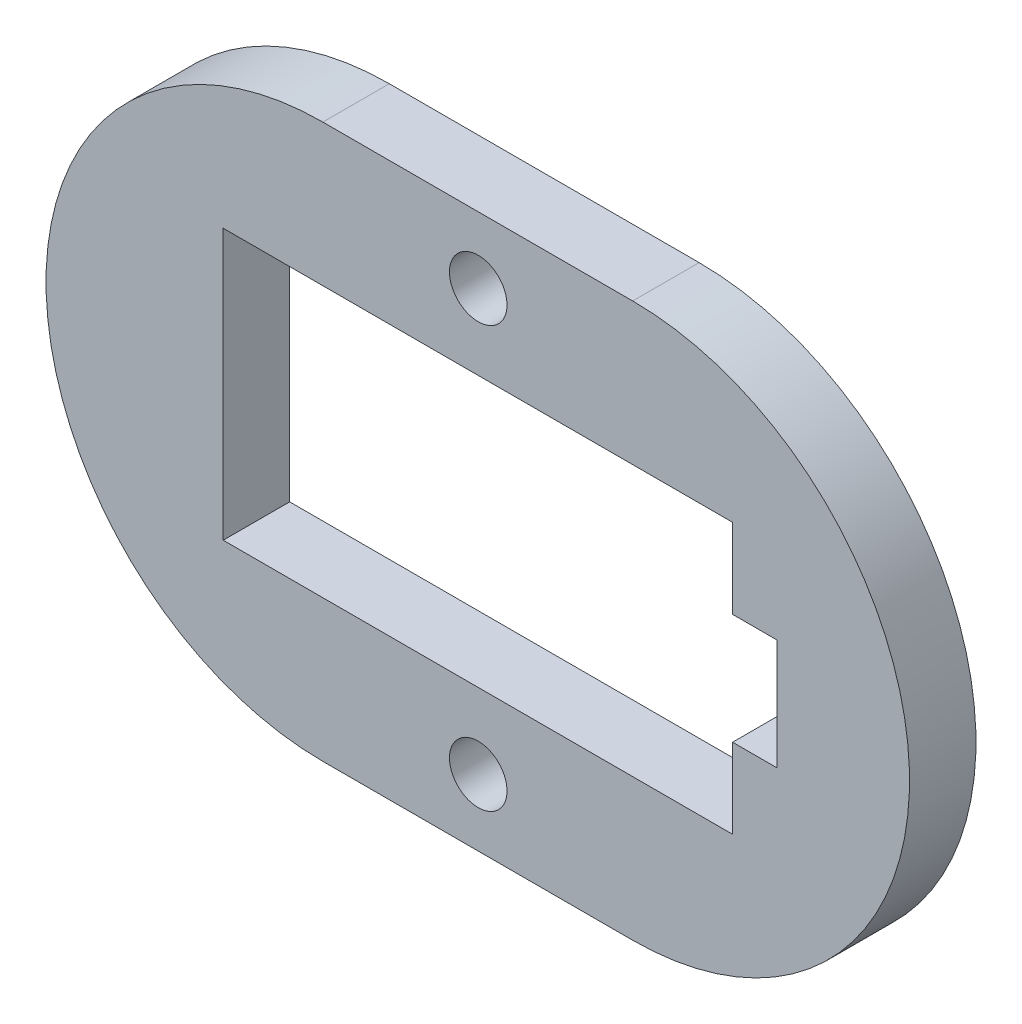
ISO-10303-21;
HEADER;
FILE_DESCRIPTION(('STEP AP214'),'2;1');
FILE_NAME('part.step','',(''),(''),'','','');
FILE_SCHEMA(('AUTOMOTIVE_DESIGN { 1 0 10303 214 1 1 1 1 }'));
ENDSEC;
DATA;
#1=APPLICATION_CONTEXT('core data for automotive mechanical design processes');
#2=APPLICATION_PROTOCOL_DEFINITION('international standard','automotive_design',2000,#1);
#3=PRODUCT_CONTEXT('',#1,'mechanical');
#4=PRODUCT('Part','Part','',(#3));
#5=PRODUCT_RELATED_PRODUCT_CATEGORY('part','',(#4));
#6=PRODUCT_DEFINITION_FORMATION('','',#4);
#7=PRODUCT_DEFINITION_CONTEXT('part definition',#1,'design');
#8=PRODUCT_DEFINITION('design','',#6,#7);
#9=PRODUCT_DEFINITION_SHAPE('','',#8);
#10=(LENGTH_UNIT() NAMED_UNIT(*) SI_UNIT(.MILLI.,.METRE.));
#11=(NAMED_UNIT(*) PLANE_ANGLE_UNIT() SI_UNIT($,.RADIAN.));
#12=(NAMED_UNIT(*) SI_UNIT($,.STERADIAN.) SOLID_ANGLE_UNIT());
#13=UNCERTAINTY_MEASURE_WITH_UNIT(LENGTH_MEASURE(1.E-05),#10,'distance_accuracy_value','');
#14=(GEOMETRIC_REPRESENTATION_CONTEXT(3) GLOBAL_UNCERTAINTY_ASSIGNED_CONTEXT((#13)) GLOBAL_UNIT_ASSIGNED_CONTEXT((#10,
#11,#12)) REPRESENTATION_CONTEXT('',''));
#15=CARTESIAN_POINT('',(0.,0.,0.));
#16=DIRECTION('',(0.,0.,1.));
#17=DIRECTION('',(1.,0.,0.));
#18=AXIS2_PLACEMENT_3D('',#15,#16,#17);
#19=CARTESIAN_POINT('',(-8.50332215613228,12.5005,0.));
#20=DIRECTION('',(0.,0.,1.));
#21=DIRECTION('',(1.,0.,0.));
#22=AXIS2_PLACEMENT_3D('',#19,#20,#21);
#23=CYLINDRICAL_SURFACE('',#22,12.5);
#24=CARTESIAN_POINT('',(-8.50332215613228,12.5005,3.));
#25=DIRECTION('',(0.,0.,1.));
#26=DIRECTION('',(1.,0.,0.));
#27=AXIS2_PLACEMENT_3D('',#24,#25,#26);
#28=CIRCLE('',#27,12.5);
#29=CARTESIAN_POINT('',(-8.50332215613228,25.0005,3.));
#30=VERTEX_POINT('',#29);
#31=CARTESIAN_POINT('',(-8.50332215613228,0.000500000000009174,3.));
#32=VERTEX_POINT('',#31);
#33=EDGE_CURVE('E203',#30,#32,#28,.T.);
#34=ORIENTED_EDGE('',*,*,#33,.F.);
#35=DIRECTION('',(0.,0.,1.));
#36=VECTOR('',#35,1.);
#37=CARTESIAN_POINT('',(-8.50332215613228,25.0005,0.));
#38=LINE('',#37,#36);
#39=CARTESIAN_POINT('',(-8.50332215613228,25.0005,0.));
#40=VERTEX_POINT('',#39);
#41=EDGE_CURVE('E11',#40,#30,#38,.T.);
#42=ORIENTED_EDGE('',*,*,#41,.F.);
#43=CARTESIAN_POINT('',(-8.50332215613228,12.5005,0.));
#44=DIRECTION('',(0.,0.,1.));
#45=DIRECTION('',(1.,0.,0.));
#46=AXIS2_PLACEMENT_3D('',#43,#44,#45);
#47=CIRCLE('',#46,12.5);
#48=CARTESIAN_POINT('',(-8.50332215613228,0.000500000000009174,0.));
#49=VERTEX_POINT('',#48);
#50=EDGE_CURVE('E206',#40,#49,#47,.T.);
#51=ORIENTED_EDGE('',*,*,#50,.T.);
#52=DIRECTION('',(0.,0.,1.));
#53=VECTOR('',#52,1.);
#54=CARTESIAN_POINT('',(-8.50332215613228,0.000500000000009174,0.));
#55=LINE('',#54,#53);
#56=EDGE_CURVE('E39',#49,#32,#55,.T.);
#57=ORIENTED_EDGE('',*,*,#56,.T.);
#58=EDGE_LOOP('',(#34,#42,#51,#57));
#59=FACE_BOUND('',#58,.T.);
#60=ADVANCED_FACE('F36',(#59),#23,.T.);
#61=CARTESIAN_POINT('',(5.48658852914815,25.0005,0.));
#62=DIRECTION('',(0.,1.,0.));
#63=DIRECTION('',(0.,0.,1.));
#64=AXIS2_PLACEMENT_3D('',#61,#62,#63);
#65=PLANE('',#64);
#66=DIRECTION('',(-1.,0.,0.));
#67=VECTOR('',#66,1.);
#68=CARTESIAN_POINT('',(5.48658852914815,25.0005,3.));
#69=LINE('',#68,#67);
#70=CARTESIAN_POINT('',(5.48658852914815,25.0005,3.));
#71=VERTEX_POINT('',#70);
#72=EDGE_CURVE('E210',#71,#30,#69,.T.);
#73=ORIENTED_EDGE('',*,*,#72,.F.);
#74=DIRECTION('',(0.,0.,1.));
#75=VECTOR('',#74,1.);
#76=CARTESIAN_POINT('',(5.48658852914815,25.0005,0.));
#77=LINE('',#76,#75);
#78=CARTESIAN_POINT('',(5.48658852914815,25.0005,0.));
#79=VERTEX_POINT('',#78);
#80=EDGE_CURVE('E44',#79,#71,#77,.T.);
#81=ORIENTED_EDGE('',*,*,#80,.F.);
#82=DIRECTION('',(-1.,0.,0.));
#83=VECTOR('',#82,1.);
#84=CARTESIAN_POINT('',(5.48658852914815,25.0005,0.));
#85=LINE('',#84,#83);
#86=EDGE_CURVE('E216',#79,#40,#85,.T.);
#87=ORIENTED_EDGE('',*,*,#86,.T.);
#88=ORIENTED_EDGE('',*,*,#41,.T.);
#89=EDGE_LOOP('',(#73,#81,#87,#88));
#90=FACE_BOUND('',#89,.T.);
#91=ADVANCED_FACE('F242',(#90),#65,.T.);
#92=CARTESIAN_POINT('',(5.48658852914815,12.5005,0.));
#93=DIRECTION('',(0.,0.,1.));
#94=DIRECTION('',(1.,0.,0.));
#95=AXIS2_PLACEMENT_3D('',#92,#93,#94);
#96=CYLINDRICAL_SURFACE('',#95,12.5);
#97=CARTESIAN_POINT('',(5.48658852914815,12.5005,3.));
#98=DIRECTION('',(0.,0.,1.));
#99=DIRECTION('',(-1.,0.,0.));
#100=AXIS2_PLACEMENT_3D('',#97,#98,#99);
#101=CIRCLE('',#100,12.5);
#102=CARTESIAN_POINT('',(5.48658852914815,0.000499999999976214,3.));
#103=VERTEX_POINT('',#102);
#104=EDGE_CURVE('E224',#103,#71,#101,.T.);
#105=ORIENTED_EDGE('',*,*,#104,.F.);
#106=DIRECTION('',(0.,0.,1.));
#107=VECTOR('',#106,1.);
#108=CARTESIAN_POINT('',(5.48658852914815,0.000499999999976214,0.));
#109=LINE('',#108,#107);
#110=CARTESIAN_POINT('',(5.48658852914815,0.000499999999976214,0.));
#111=VERTEX_POINT('',#110);
#112=EDGE_CURVE('E229',#111,#103,#109,.T.);
#113=ORIENTED_EDGE('',*,*,#112,.F.);
#114=CARTESIAN_POINT('',(5.48658852914815,12.5005,0.));
#115=DIRECTION('',(0.,0.,1.));
#116=DIRECTION('',(-1.,0.,0.));
#117=AXIS2_PLACEMENT_3D('',#114,#115,#116);
#118=CIRCLE('',#117,12.5);
#119=EDGE_CURVE('E213',#111,#79,#118,.T.);
#120=ORIENTED_EDGE('',*,*,#119,.T.);
#121=ORIENTED_EDGE('',*,*,#80,.T.);
#122=EDGE_LOOP('',(#105,#113,#120,#121));
#123=FACE_BOUND('',#122,.T.);
#124=ADVANCED_FACE('F247',(#123),#96,.T.);
#125=CARTESIAN_POINT('',(-8.50332215613228,0.000500000000009174,0.));
#126=DIRECTION('',(0.,-1.,0.));
#127=DIRECTION('',(1.,0.,0.));
#128=AXIS2_PLACEMENT_3D('',#125,#126,#127);
#129=PLANE('',#128);
#130=DIRECTION('',(1.,0.,0.));
#131=VECTOR('',#130,1.);
#132=CARTESIAN_POINT('',(-8.50332215613228,0.000500000000009174,3.));
#133=LINE('',#132,#131);
#134=EDGE_CURVE('E221',#32,#103,#133,.T.);
#135=ORIENTED_EDGE('',*,*,#134,.F.);
#136=ORIENTED_EDGE('',*,*,#56,.F.);
#137=DIRECTION('',(1.,0.,0.));
#138=VECTOR('',#137,1.);
#139=CARTESIAN_POINT('',(-8.50332215613228,0.000500000000009174,0.));
#140=LINE('',#139,#138);
#141=EDGE_CURVE('E209',#49,#111,#140,.T.);
#142=ORIENTED_EDGE('',*,*,#141,.T.);
#143=ORIENTED_EDGE('',*,*,#112,.T.);
#144=EDGE_LOOP('',(#135,#136,#142,#143));
#145=FACE_BOUND('',#144,.T.);
#146=ADVANCED_FACE('F237',(#145),#129,.T.);
#147=CARTESIAN_POINT('',(-8.50332215613228,12.5005,0.));
#148=DIRECTION('',(0.,0.,1.));
#149=DIRECTION('',(1.,0.,0.));
#150=AXIS2_PLACEMENT_3D('',#147,#148,#149);
#151=PLANE('',#150);
#152=DIRECTION('',(0.,1.,0.));
#153=VECTOR('',#152,1.);
#154=CARTESIAN_POINT('',(11.9977947172437,15.,0.));
#155=LINE('',#154,#153);
#156=CARTESIAN_POINT('',(11.9977947172437,10.001,0.));
#157=VERTEX_POINT('',#156);
#158=CARTESIAN_POINT('',(11.9977947172437,15.,0.));
#159=VERTEX_POINT('',#158);
#160=EDGE_CURVE('E133',#157,#159,#155,.T.);
#161=ORIENTED_EDGE('',*,*,#160,.T.);
#162=DIRECTION('',(-1.,0.,0.));
#163=VECTOR('',#162,1.);
#164=CARTESIAN_POINT('',(9.99689471724373,15.,0.));
#165=LINE('',#164,#163);
#166=CARTESIAN_POINT('',(9.99689471724373,15.,0.));
#167=VERTEX_POINT('',#166);
#168=EDGE_CURVE('E127',#159,#167,#165,.T.);
#169=ORIENTED_EDGE('',*,*,#168,.T.);
#170=DIRECTION('',(0.,1.,0.));
#171=VECTOR('',#170,1.);
#172=CARTESIAN_POINT('',(9.99689471724373,18.6,0.));
#173=LINE('',#172,#171);
#174=CARTESIAN_POINT('',(9.99689471724373,18.6,0.));
#175=VERTEX_POINT('',#174);
#176=EDGE_CURVE('E136',#167,#175,#173,.T.);
#177=ORIENTED_EDGE('',*,*,#176,.T.);
#178=DIRECTION('',(-1.,0.,0.));
#179=VECTOR('',#178,1.);
#180=CARTESIAN_POINT('',(-13.0026052827563,18.6,0.));
#181=LINE('',#180,#179);
#182=CARTESIAN_POINT('',(-13.0026052827563,18.6,0.));
#183=VERTEX_POINT('',#182);
#184=EDGE_CURVE('E52',#175,#183,#181,.T.);
#185=ORIENTED_EDGE('',*,*,#184,.T.);
#186=DIRECTION('',(0.,-1.,0.));
#187=VECTOR('',#186,1.);
#188=CARTESIAN_POINT('',(-13.0026052827563,6.4,0.));
#189=LINE('',#188,#187);
#190=CARTESIAN_POINT('',(-13.0026052827563,6.4,0.));
#191=VERTEX_POINT('',#190);
#192=EDGE_CURVE('E151',#183,#191,#189,.T.);
#193=ORIENTED_EDGE('',*,*,#192,.T.);
#194=DIRECTION('',(1.,0.,0.));
#195=VECTOR('',#194,1.);
#196=CARTESIAN_POINT('',(9.99689471724373,6.4,0.));
#197=LINE('',#196,#195);
#198=CARTESIAN_POINT('',(9.99689471724373,6.4,0.));
#199=VERTEX_POINT('',#198);
#200=EDGE_CURVE('E154',#191,#199,#197,.T.);
#201=ORIENTED_EDGE('',*,*,#200,.T.);
#202=DIRECTION('',(0.,1.,0.));
#203=VECTOR('',#202,1.);
#204=CARTESIAN_POINT('',(9.99689471724373,10.001,0.));
#205=LINE('',#204,#203);
#206=CARTESIAN_POINT('',(9.99689471724373,10.001,0.));
#207=VERTEX_POINT('',#206);
#208=EDGE_CURVE('E157',#199,#207,#205,.T.);
#209=ORIENTED_EDGE('',*,*,#208,.T.);
#210=DIRECTION('',(1.,0.,0.));
#211=VECTOR('',#210,1.);
#212=CARTESIAN_POINT('',(11.9977947172437,10.001,0.));
#213=LINE('',#212,#211);
#214=EDGE_CURVE('E160',#207,#157,#213,.T.);
#215=ORIENTED_EDGE('',*,*,#214,.T.);
#216=EDGE_LOOP('',(#161,#169,#177,#185,#193,#201,#209,#215));
#217=FACE_BOUND('',#216,.T.);
#218=CARTESIAN_POINT('',(-1.48790597129112,22.0005,0.));
#219=DIRECTION('',(0.,0.,1.));
#220=DIRECTION('',(-1.,0.,0.));
#221=AXIS2_PLACEMENT_3D('',#218,#219,#220);
#222=CIRCLE('',#221,1.3);
#223=CARTESIAN_POINT('',(-2.78790597129112,22.0005,0.));
#224=VERTEX_POINT('',#223);
#225=EDGE_CURVE('E194',#224,#224,#222,.T.);
#226=ORIENTED_EDGE('',*,*,#225,.T.);
#227=EDGE_LOOP('',(#226));
#228=FACE_BOUND('',#227,.T.);
#229=CARTESIAN_POINT('',(-1.48790597129112,2.9995,0.));
#230=DIRECTION('',(0.,0.,1.));
#231=DIRECTION('',(-1.,0.,0.));
#232=AXIS2_PLACEMENT_3D('',#229,#230,#231);
#233=CIRCLE('',#232,1.3);
#234=CARTESIAN_POINT('',(-2.78790597129112,2.9995,0.));
#235=VERTEX_POINT('',#234);
#236=EDGE_CURVE('E200',#235,#235,#233,.T.);
#237=ORIENTED_EDGE('',*,*,#236,.T.);
#238=EDGE_LOOP('',(#237));
#239=FACE_BOUND('',#238,.T.);
#240=ORIENTED_EDGE('',*,*,#50,.F.);
#241=ORIENTED_EDGE('',*,*,#86,.F.);
#242=ORIENTED_EDGE('',*,*,#119,.F.);
#243=ORIENTED_EDGE('',*,*,#141,.F.);
#244=EDGE_LOOP('',(#240,#241,#242,#243));
#245=FACE_BOUND('',#244,.T.);
#246=ADVANCED_FACE('F140',(#217,#228,#239,#245),#151,.F.);
#247=CARTESIAN_POINT('',(-8.50332215613228,12.5005,3.));
#248=DIRECTION('',(0.,0.,1.));
#249=DIRECTION('',(1.,0.,0.));
#250=AXIS2_PLACEMENT_3D('',#247,#248,#249);
#251=PLANE('',#250);
#252=DIRECTION('',(-1.,0.,0.));
#253=VECTOR('',#252,1.);
#254=CARTESIAN_POINT('',(9.99689471724373,15.,3.));
#255=LINE('',#254,#253);
#256=CARTESIAN_POINT('',(11.9977947172437,15.,3.));
#257=VERTEX_POINT('',#256);
#258=CARTESIAN_POINT('',(9.99689471724373,15.,3.));
#259=VERTEX_POINT('',#258);
#260=EDGE_CURVE('E60',#257,#259,#255,.T.);
#261=ORIENTED_EDGE('',*,*,#260,.F.);
#262=DIRECTION('',(0.,1.,0.));
#263=VECTOR('',#262,1.);
#264=CARTESIAN_POINT('',(11.9977947172437,15.,3.));
#265=LINE('',#264,#263);
#266=CARTESIAN_POINT('',(11.9977947172437,10.001,3.));
#267=VERTEX_POINT('',#266);
#268=EDGE_CURVE('E144',#267,#257,#265,.T.);
#269=ORIENTED_EDGE('',*,*,#268,.F.);
#270=DIRECTION('',(1.,0.,0.));
#271=VECTOR('',#270,1.);
#272=CARTESIAN_POINT('',(11.9977947172437,10.001,3.));
#273=LINE('',#272,#271);
#274=CARTESIAN_POINT('',(9.99689471724373,10.001,3.));
#275=VERTEX_POINT('',#274);
#276=EDGE_CURVE('E147',#275,#267,#273,.T.);
#277=ORIENTED_EDGE('',*,*,#276,.F.);
#278=DIRECTION('',(0.,1.,0.));
#279=VECTOR('',#278,1.);
#280=CARTESIAN_POINT('',(9.99689471724373,10.001,3.));
#281=LINE('',#280,#279);
#282=CARTESIAN_POINT('',(9.99689471724373,6.4,3.));
#283=VERTEX_POINT('',#282);
#284=EDGE_CURVE('E175',#283,#275,#281,.T.);
#285=ORIENTED_EDGE('',*,*,#284,.F.);
#286=DIRECTION('',(1.,0.,0.));
#287=VECTOR('',#286,1.);
#288=CARTESIAN_POINT('',(9.99689471724373,6.4,3.));
#289=LINE('',#288,#287);
#290=CARTESIAN_POINT('',(-13.0026052827563,6.4,3.));
#291=VERTEX_POINT('',#290);
#292=EDGE_CURVE('E172',#291,#283,#289,.T.);
#293=ORIENTED_EDGE('',*,*,#292,.F.);
#294=DIRECTION('',(0.,-1.,0.));
#295=VECTOR('',#294,1.);
#296=CARTESIAN_POINT('',(-13.0026052827563,6.4,3.));
#297=LINE('',#296,#295);
#298=CARTESIAN_POINT('',(-13.0026052827563,18.6,3.));
#299=VERTEX_POINT('',#298);
#300=EDGE_CURVE('E169',#299,#291,#297,.T.);
#301=ORIENTED_EDGE('',*,*,#300,.F.);
#302=DIRECTION('',(-1.,0.,0.));
#303=VECTOR('',#302,1.);
#304=CARTESIAN_POINT('',(-13.0026052827563,18.6,3.));
#305=LINE('',#304,#303);
#306=CARTESIAN_POINT('',(9.99689471724373,18.6,3.));
#307=VERTEX_POINT('',#306);
#308=EDGE_CURVE('E166',#307,#299,#305,.T.);
#309=ORIENTED_EDGE('',*,*,#308,.F.);
#310=DIRECTION('',(0.,1.,0.));
#311=VECTOR('',#310,1.);
#312=CARTESIAN_POINT('',(9.99689471724373,18.6,3.));
#313=LINE('',#312,#311);
#314=EDGE_CURVE('E164',#259,#307,#313,.T.);
#315=ORIENTED_EDGE('',*,*,#314,.F.);
#316=EDGE_LOOP('',(#261,#269,#277,#285,#293,#301,#309,#315));
#317=FACE_BOUND('',#316,.T.);
#318=CARTESIAN_POINT('',(-1.48790597129112,22.0005,3.));
#319=DIRECTION('',(0.,0.,1.));
#320=DIRECTION('',(-1.,0.,0.));
#321=AXIS2_PLACEMENT_3D('',#318,#319,#320);
#322=CIRCLE('',#321,1.3);
#323=CARTESIAN_POINT('',(-2.78790597129112,22.0005,3.));
#324=VERTEX_POINT('',#323);
#325=EDGE_CURVE('E182',#324,#324,#322,.T.);
#326=ORIENTED_EDGE('',*,*,#325,.F.);
#327=EDGE_LOOP('',(#326));
#328=FACE_BOUND('',#327,.T.);
#329=CARTESIAN_POINT('',(-1.48790597129112,2.9995,3.));
#330=DIRECTION('',(0.,0.,1.));
#331=DIRECTION('',(-1.,0.,0.));
#332=AXIS2_PLACEMENT_3D('',#329,#330,#331);
#333=CIRCLE('',#332,1.3);
#334=CARTESIAN_POINT('',(-2.78790597129112,2.9995,3.));
#335=VERTEX_POINT('',#334);
#336=EDGE_CURVE('E197',#335,#335,#333,.T.);
#337=ORIENTED_EDGE('',*,*,#336,.F.);
#338=EDGE_LOOP('',(#337));
#339=FACE_BOUND('',#338,.T.);
#340=ORIENTED_EDGE('',*,*,#33,.T.);
#341=ORIENTED_EDGE('',*,*,#134,.T.);
#342=ORIENTED_EDGE('',*,*,#104,.T.);
#343=ORIENTED_EDGE('',*,*,#72,.T.);
#344=EDGE_LOOP('',(#340,#341,#342,#343));
#345=FACE_BOUND('',#344,.T.);
#346=ADVANCED_FACE('F239',(#317,#328,#339,#345),#251,.T.);
#347=CARTESIAN_POINT('',(-1.48790597129112,2.9995,0.));
#348=DIRECTION('',(0.,0.,1.));
#349=DIRECTION('',(1.,0.,0.));
#350=AXIS2_PLACEMENT_3D('',#347,#348,#349);
#351=CYLINDRICAL_SURFACE('',#350,1.3);
#352=ORIENTED_EDGE('',*,*,#236,.F.);
#353=EDGE_LOOP('',(#352));
#354=FACE_BOUND('',#353,.T.);
#355=ORIENTED_EDGE('',*,*,#336,.T.);
#356=EDGE_LOOP('',(#355));
#357=FACE_BOUND('',#356,.T.);
#358=ADVANCED_FACE('F289',(#354,#357),#351,.F.);
#359=CARTESIAN_POINT('',(-1.48790597129112,22.0005,0.));
#360=DIRECTION('',(0.,0.,1.));
#361=DIRECTION('',(1.,0.,0.));
#362=AXIS2_PLACEMENT_3D('',#359,#360,#361);
#363=CYLINDRICAL_SURFACE('',#362,1.3);
#364=ORIENTED_EDGE('',*,*,#225,.F.);
#365=EDGE_LOOP('',(#364));
#366=FACE_BOUND('',#365,.T.);
#367=ORIENTED_EDGE('',*,*,#325,.T.);
#368=EDGE_LOOP('',(#367));
#369=FACE_BOUND('',#368,.T.);
#370=ADVANCED_FACE('F299',(#366,#369),#363,.F.);
#371=CARTESIAN_POINT('',(9.99689471724373,15.,0.));
#372=DIRECTION('',(0.,1.,0.));
#373=DIRECTION('',(0.,0.,1.));
#374=AXIS2_PLACEMENT_3D('',#371,#372,#373);
#375=PLANE('',#374);
#376=ORIENTED_EDGE('',*,*,#260,.T.);
#377=DIRECTION('',(0.,0.,1.));
#378=VECTOR('',#377,1.);
#379=CARTESIAN_POINT('',(9.99689471724373,15.,0.));
#380=LINE('',#379,#378);
#381=EDGE_CURVE('E123',#167,#259,#380,.T.);
#382=ORIENTED_EDGE('',*,*,#381,.F.);
#383=ORIENTED_EDGE('',*,*,#168,.F.);
#384=DIRECTION('',(0.,0.,1.));
#385=VECTOR('',#384,1.);
#386=CARTESIAN_POINT('',(11.9977947172437,15.,0.));
#387=LINE('',#386,#385);
#388=EDGE_CURVE('E180',#159,#257,#387,.T.);
#389=ORIENTED_EDGE('',*,*,#388,.T.);
#390=EDGE_LOOP('',(#376,#382,#383,#389));
#391=FACE_BOUND('',#390,.T.);
#392=ADVANCED_FACE('F125',(#391),#375,.F.);
#393=CARTESIAN_POINT('',(11.9977947172437,15.,0.));
#394=DIRECTION('',(1.,0.,0.));
#395=DIRECTION('',(0.,0.,-1.));
#396=AXIS2_PLACEMENT_3D('',#393,#394,#395);
#397=PLANE('',#396);
#398=ORIENTED_EDGE('',*,*,#268,.T.);
#399=ORIENTED_EDGE('',*,*,#388,.F.);
#400=ORIENTED_EDGE('',*,*,#160,.F.);
#401=DIRECTION('',(0.,0.,1.));
#402=VECTOR('',#401,1.);
#403=CARTESIAN_POINT('',(11.9977947172437,10.001,0.));
#404=LINE('',#403,#402);
#405=EDGE_CURVE('E183',#157,#267,#404,.T.);
#406=ORIENTED_EDGE('',*,*,#405,.T.);
#407=EDGE_LOOP('',(#398,#399,#400,#406));
#408=FACE_BOUND('',#407,.T.);
#409=ADVANCED_FACE('F318',(#408),#397,.F.);
#410=CARTESIAN_POINT('',(11.9977947172437,10.001,0.));
#411=DIRECTION('',(0.,-1.,0.));
#412=DIRECTION('',(0.,0.,-1.));
#413=AXIS2_PLACEMENT_3D('',#410,#411,#412);
#414=PLANE('',#413);
#415=ORIENTED_EDGE('',*,*,#276,.T.);
#416=ORIENTED_EDGE('',*,*,#405,.F.);
#417=ORIENTED_EDGE('',*,*,#214,.F.);
#418=DIRECTION('',(0.,0.,1.));
#419=VECTOR('',#418,1.);
#420=CARTESIAN_POINT('',(9.99689471724373,10.001,0.));
#421=LINE('',#420,#419);
#422=EDGE_CURVE('E185',#207,#275,#421,.T.);
#423=ORIENTED_EDGE('',*,*,#422,.T.);
#424=EDGE_LOOP('',(#415,#416,#417,#423));
#425=FACE_BOUND('',#424,.T.);
#426=ADVANCED_FACE('F327',(#425),#414,.F.);
#427=CARTESIAN_POINT('',(9.99689471724373,10.001,0.));
#428=DIRECTION('',(1.,0.,0.));
#429=DIRECTION('',(0.,0.,-1.));
#430=AXIS2_PLACEMENT_3D('',#427,#428,#429);
#431=PLANE('',#430);
#432=ORIENTED_EDGE('',*,*,#284,.T.);
#433=ORIENTED_EDGE('',*,*,#422,.F.);
#434=ORIENTED_EDGE('',*,*,#208,.F.);
#435=DIRECTION('',(0.,0.,1.));
#436=VECTOR('',#435,1.);
#437=CARTESIAN_POINT('',(9.99689471724373,6.4,0.));
#438=LINE('',#437,#436);
#439=EDGE_CURVE('E187',#199,#283,#438,.T.);
#440=ORIENTED_EDGE('',*,*,#439,.T.);
#441=EDGE_LOOP('',(#432,#433,#434,#440));
#442=FACE_BOUND('',#441,.T.);
#443=ADVANCED_FACE('F337',(#442),#431,.F.);
#444=CARTESIAN_POINT('',(9.99689471724373,6.4,0.));
#445=DIRECTION('',(0.,-1.,0.));
#446=DIRECTION('',(0.,0.,-1.));
#447=AXIS2_PLACEMENT_3D('',#444,#445,#446);
#448=PLANE('',#447);
#449=ORIENTED_EDGE('',*,*,#292,.T.);
#450=ORIENTED_EDGE('',*,*,#439,.F.);
#451=ORIENTED_EDGE('',*,*,#200,.F.);
#452=DIRECTION('',(0.,0.,1.));
#453=VECTOR('',#452,1.);
#454=CARTESIAN_POINT('',(-13.0026052827563,6.4,0.));
#455=LINE('',#454,#453);
#456=EDGE_CURVE('E189',#191,#291,#455,.T.);
#457=ORIENTED_EDGE('',*,*,#456,.T.);
#458=EDGE_LOOP('',(#449,#450,#451,#457));
#459=FACE_BOUND('',#458,.T.);
#460=ADVANCED_FACE('F347',(#459),#448,.F.);
#461=CARTESIAN_POINT('',(-13.0026052827563,6.4,0.));
#462=DIRECTION('',(-1.,0.,0.));
#463=DIRECTION('',(0.,0.,1.));
#464=AXIS2_PLACEMENT_3D('',#461,#462,#463);
#465=PLANE('',#464);
#466=ORIENTED_EDGE('',*,*,#300,.T.);
#467=ORIENTED_EDGE('',*,*,#456,.F.);
#468=ORIENTED_EDGE('',*,*,#192,.F.);
#469=DIRECTION('',(0.,0.,1.));
#470=VECTOR('',#469,1.);
#471=CARTESIAN_POINT('',(-13.0026052827563,18.6,0.));
#472=LINE('',#471,#470);
#473=EDGE_CURVE('E191',#183,#299,#472,.T.);
#474=ORIENTED_EDGE('',*,*,#473,.T.);
#475=EDGE_LOOP('',(#466,#467,#468,#474));
#476=FACE_BOUND('',#475,.T.);
#477=ADVANCED_FACE('F357',(#476),#465,.F.);
#478=CARTESIAN_POINT('',(-13.0026052827563,18.6,0.));
#479=DIRECTION('',(0.,1.,0.));
#480=DIRECTION('',(0.,0.,1.));
#481=AXIS2_PLACEMENT_3D('',#478,#479,#480);
#482=PLANE('',#481);
#483=ORIENTED_EDGE('',*,*,#308,.T.);
#484=ORIENTED_EDGE('',*,*,#473,.F.);
#485=ORIENTED_EDGE('',*,*,#184,.F.);
#486=DIRECTION('',(0.,0.,1.));
#487=VECTOR('',#486,1.);
#488=CARTESIAN_POINT('',(9.99689471724373,18.6,0.));
#489=LINE('',#488,#487);
#490=EDGE_CURVE('E132',#175,#307,#489,.T.);
#491=ORIENTED_EDGE('',*,*,#490,.T.);
#492=EDGE_LOOP('',(#483,#484,#485,#491));
#493=FACE_BOUND('',#492,.T.);
#494=ADVANCED_FACE('F367',(#493),#482,.F.);
#495=CARTESIAN_POINT('',(9.99689471724373,18.6,0.));
#496=DIRECTION('',(1.,0.,0.));
#497=DIRECTION('',(0.,0.,-1.));
#498=AXIS2_PLACEMENT_3D('',#495,#496,#497);
#499=PLANE('',#498);
#500=ORIENTED_EDGE('',*,*,#314,.T.);
#501=ORIENTED_EDGE('',*,*,#490,.F.);
#502=ORIENTED_EDGE('',*,*,#176,.F.);
#503=ORIENTED_EDGE('',*,*,#381,.T.);
#504=EDGE_LOOP('',(#500,#501,#502,#503));
#505=FACE_BOUND('',#504,.T.);
#506=ADVANCED_FACE('F137',(#505),#499,.F.);
#507=CLOSED_SHELL('',(#60,#91,#124,#146,#246,#346,#358,#370,#392,#409,#426,#443,#460,#477,#494,#506));
#508=MANIFOLD_SOLID_BREP('B2',#507);
#509=ADVANCED_BREP_SHAPE_REPRESENTATION('',(#18,#508),#14);
#510=SHAPE_DEFINITION_REPRESENTATION(#9,#509);
ENDSEC;
END-ISO-10303-21;
